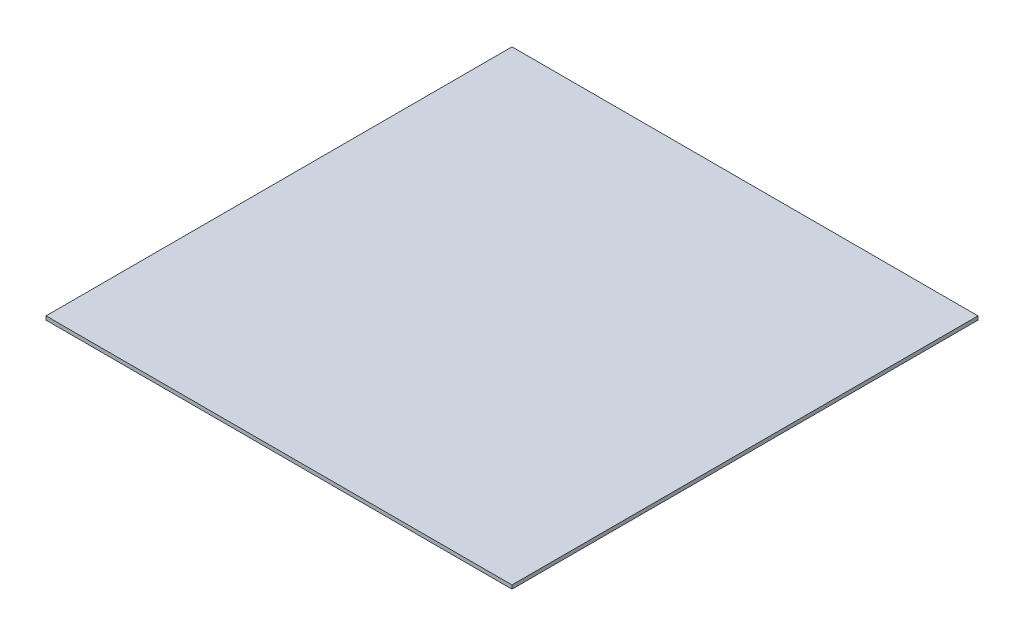
ISO-10303-21;
HEADER;
FILE_DESCRIPTION(('STEP AP214'),'2;1');
FILE_NAME('part.step','',(''),(''),'','','');
FILE_SCHEMA(('AUTOMOTIVE_DESIGN { 1 0 10303 214 1 1 1 1 }'));
ENDSEC;
DATA;
#1=APPLICATION_CONTEXT('core data for automotive mechanical design processes');
#2=APPLICATION_PROTOCOL_DEFINITION('international standard','automotive_design',2000,#1);
#3=PRODUCT_CONTEXT('',#1,'mechanical');
#4=PRODUCT('Part','Part','',(#3));
#5=PRODUCT_RELATED_PRODUCT_CATEGORY('part','',(#4));
#6=PRODUCT_DEFINITION_FORMATION('','',#4);
#7=PRODUCT_DEFINITION_CONTEXT('part definition',#1,'design');
#8=PRODUCT_DEFINITION('design','',#6,#7);
#9=PRODUCT_DEFINITION_SHAPE('','',#8);
#10=(LENGTH_UNIT() NAMED_UNIT(*) SI_UNIT(.MILLI.,.METRE.));
#11=(NAMED_UNIT(*) PLANE_ANGLE_UNIT() SI_UNIT($,.RADIAN.));
#12=(NAMED_UNIT(*) SI_UNIT($,.STERADIAN.) SOLID_ANGLE_UNIT());
#13=UNCERTAINTY_MEASURE_WITH_UNIT(LENGTH_MEASURE(1.E-05),#10,'distance_accuracy_value','');
#14=(GEOMETRIC_REPRESENTATION_CONTEXT(3) GLOBAL_UNCERTAINTY_ASSIGNED_CONTEXT((#13)) GLOBAL_UNIT_ASSIGNED_CONTEXT((#10,
#11,#12)) REPRESENTATION_CONTEXT('',''));
#15=CARTESIAN_POINT('',(0.,0.,0.));
#16=DIRECTION('',(0.,0.,1.));
#17=DIRECTION('',(1.,0.,0.));
#18=AXIS2_PLACEMENT_3D('',#15,#16,#17);
#19=CARTESIAN_POINT('',(0.,3.175,0.));
#20=DIRECTION('',(1.,0.,0.));
#21=DIRECTION('',(0.,0.,-1.));
#22=AXIS2_PLACEMENT_3D('',#19,#20,#21);
#23=PLANE('',#22);
#24=DIRECTION('',(0.,0.,1.));
#25=VECTOR('',#24,1.);
#26=CARTESIAN_POINT('',(0.,0.,0.));
#27=LINE('',#26,#25);
#28=CARTESIAN_POINT('',(0.,0.,-400.));
#29=VERTEX_POINT('',#28);
#30=CARTESIAN_POINT('',(0.,0.,0.));
#31=VERTEX_POINT('',#30);
#32=EDGE_CURVE('E96',#29,#31,#27,.T.);
#33=ORIENTED_EDGE('',*,*,#32,.T.);
#34=DIRECTION('',(0.,-1.,0.));
#35=VECTOR('',#34,1.);
#36=CARTESIAN_POINT('',(0.,3.175,0.));
#37=LINE('',#36,#35);
#38=CARTESIAN_POINT('',(0.,3.175,0.));
#39=VERTEX_POINT('',#38);
#40=EDGE_CURVE('E11',#39,#31,#37,.T.);
#41=ORIENTED_EDGE('',*,*,#40,.F.);
#42=DIRECTION('',(0.,0.,1.));
#43=VECTOR('',#42,1.);
#44=CARTESIAN_POINT('',(0.,3.175,0.));
#45=LINE('',#44,#43);
#46=CARTESIAN_POINT('',(0.,3.175,-400.));
#47=VERTEX_POINT('',#46);
#48=EDGE_CURVE('E84',#47,#39,#45,.T.);
#49=ORIENTED_EDGE('',*,*,#48,.F.);
#50=DIRECTION('',(0.,-1.,0.));
#51=VECTOR('',#50,1.);
#52=CARTESIAN_POINT('',(0.,3.175,-400.));
#53=LINE('',#52,#51);
#54=EDGE_CURVE('E92',#47,#29,#53,.T.);
#55=ORIENTED_EDGE('',*,*,#54,.T.);
#56=EDGE_LOOP('',(#33,#41,#49,#55));
#57=FACE_BOUND('',#56,.T.);
#58=ADVANCED_FACE('F33',(#57),#23,.F.);
#59=CARTESIAN_POINT('',(0.,3.175,0.));
#60=DIRECTION('',(0.,0.,-1.));
#61=DIRECTION('',(-1.,0.,0.));
#62=AXIS2_PLACEMENT_3D('',#59,#60,#61);
#63=PLANE('',#62);
#64=DIRECTION('',(1.,0.,0.));
#65=VECTOR('',#64,1.);
#66=CARTESIAN_POINT('',(0.,0.,0.));
#67=LINE('',#66,#65);
#68=CARTESIAN_POINT('',(400.,0.,0.));
#69=VERTEX_POINT('',#68);
#70=EDGE_CURVE('E88',#31,#69,#67,.T.);
#71=ORIENTED_EDGE('',*,*,#70,.T.);
#72=DIRECTION('',(0.,-1.,0.));
#73=VECTOR('',#72,1.);
#74=CARTESIAN_POINT('',(400.,3.175,0.));
#75=LINE('',#74,#73);
#76=CARTESIAN_POINT('',(400.,3.175,0.));
#77=VERTEX_POINT('',#76);
#78=EDGE_CURVE('E41',#77,#69,#75,.T.);
#79=ORIENTED_EDGE('',*,*,#78,.F.);
#80=DIRECTION('',(1.,0.,0.));
#81=VECTOR('',#80,1.);
#82=CARTESIAN_POINT('',(0.,3.175,0.));
#83=LINE('',#82,#81);
#84=EDGE_CURVE('E79',#39,#77,#83,.T.);
#85=ORIENTED_EDGE('',*,*,#84,.F.);
#86=ORIENTED_EDGE('',*,*,#40,.T.);
#87=EDGE_LOOP('',(#71,#79,#85,#86));
#88=FACE_BOUND('',#87,.T.);
#89=ADVANCED_FACE('F87',(#88),#63,.F.);
#90=CARTESIAN_POINT('',(400.,3.175,0.));
#91=DIRECTION('',(-1.,0.,0.));
#92=DIRECTION('',(0.,0.,1.));
#93=AXIS2_PLACEMENT_3D('',#90,#91,#92);
#94=PLANE('',#93);
#95=DIRECTION('',(0.,0.,-1.));
#96=VECTOR('',#95,1.);
#97=CARTESIAN_POINT('',(400.,0.,0.));
#98=LINE('',#97,#96);
#99=CARTESIAN_POINT('',(400.,0.,-400.));
#100=VERTEX_POINT('',#99);
#101=EDGE_CURVE('E66',#69,#100,#98,.T.);
#102=ORIENTED_EDGE('',*,*,#101,.T.);
#103=DIRECTION('',(0.,-1.,0.));
#104=VECTOR('',#103,1.);
#105=CARTESIAN_POINT('',(400.,3.175,-400.));
#106=LINE('',#105,#104);
#107=CARTESIAN_POINT('',(400.,3.175,-400.));
#108=VERTEX_POINT('',#107);
#109=EDGE_CURVE('E89',#108,#100,#106,.T.);
#110=ORIENTED_EDGE('',*,*,#109,.F.);
#111=DIRECTION('',(0.,0.,-1.));
#112=VECTOR('',#111,1.);
#113=CARTESIAN_POINT('',(400.,3.175,0.));
#114=LINE('',#113,#112);
#115=EDGE_CURVE('E82',#77,#108,#114,.T.);
#116=ORIENTED_EDGE('',*,*,#115,.F.);
#117=ORIENTED_EDGE('',*,*,#78,.T.);
#118=EDGE_LOOP('',(#102,#110,#116,#117));
#119=FACE_BOUND('',#118,.T.);
#120=ADVANCED_FACE('F90',(#119),#94,.F.);
#121=CARTESIAN_POINT('',(0.,3.175,-400.));
#122=DIRECTION('',(0.,0.,1.));
#123=DIRECTION('',(1.,0.,0.));
#124=AXIS2_PLACEMENT_3D('',#121,#122,#123);
#125=PLANE('',#124);
#126=DIRECTION('',(-1.,0.,0.));
#127=VECTOR('',#126,1.);
#128=CARTESIAN_POINT('',(0.,0.,-400.));
#129=LINE('',#128,#127);
#130=EDGE_CURVE('E72',#100,#29,#129,.T.);
#131=ORIENTED_EDGE('',*,*,#130,.T.);
#132=ORIENTED_EDGE('',*,*,#54,.F.);
#133=DIRECTION('',(-1.,0.,0.));
#134=VECTOR('',#133,1.);
#135=CARTESIAN_POINT('',(0.,3.175,-400.));
#136=LINE('',#135,#134);
#137=EDGE_CURVE('E49',#108,#47,#136,.T.);
#138=ORIENTED_EDGE('',*,*,#137,.F.);
#139=ORIENTED_EDGE('',*,*,#109,.T.);
#140=EDGE_LOOP('',(#131,#132,#138,#139));
#141=FACE_BOUND('',#140,.T.);
#142=ADVANCED_FACE('F103',(#141),#125,.F.);
#143=CARTESIAN_POINT('',(0.,3.175,0.));
#144=DIRECTION('',(0.,-1.,0.));
#145=DIRECTION('',(0.,0.,-1.));
#146=AXIS2_PLACEMENT_3D('',#143,#144,#145);
#147=PLANE('',#146);
#148=ORIENTED_EDGE('',*,*,#48,.T.);
#149=ORIENTED_EDGE('',*,*,#84,.T.);
#150=ORIENTED_EDGE('',*,*,#115,.T.);
#151=ORIENTED_EDGE('',*,*,#137,.T.);
#152=EDGE_LOOP('',(#148,#149,#150,#151));
#153=FACE_BOUND('',#152,.T.);
#154=ADVANCED_FACE('F80',(#153),#147,.F.);
#155=CARTESIAN_POINT('',(0.,0.,0.));
#156=DIRECTION('',(0.,-1.,0.));
#157=DIRECTION('',(0.,0.,-1.));
#158=AXIS2_PLACEMENT_3D('',#155,#156,#157);
#159=PLANE('',#158);
#160=ORIENTED_EDGE('',*,*,#32,.F.);
#161=ORIENTED_EDGE('',*,*,#130,.F.);
#162=ORIENTED_EDGE('',*,*,#101,.F.);
#163=ORIENTED_EDGE('',*,*,#70,.F.);
#164=EDGE_LOOP('',(#160,#161,#162,#163));
#165=FACE_BOUND('',#164,.T.);
#166=ADVANCED_FACE('F106',(#165),#159,.T.);
#167=CLOSED_SHELL('',(#58,#89,#120,#142,#154,#166));
#168=MANIFOLD_SOLID_BREP('B2',#167);
#169=ADVANCED_BREP_SHAPE_REPRESENTATION('',(#18,#168),#14);
#170=SHAPE_DEFINITION_REPRESENTATION(#9,#169);
ENDSEC;
END-ISO-10303-21;
